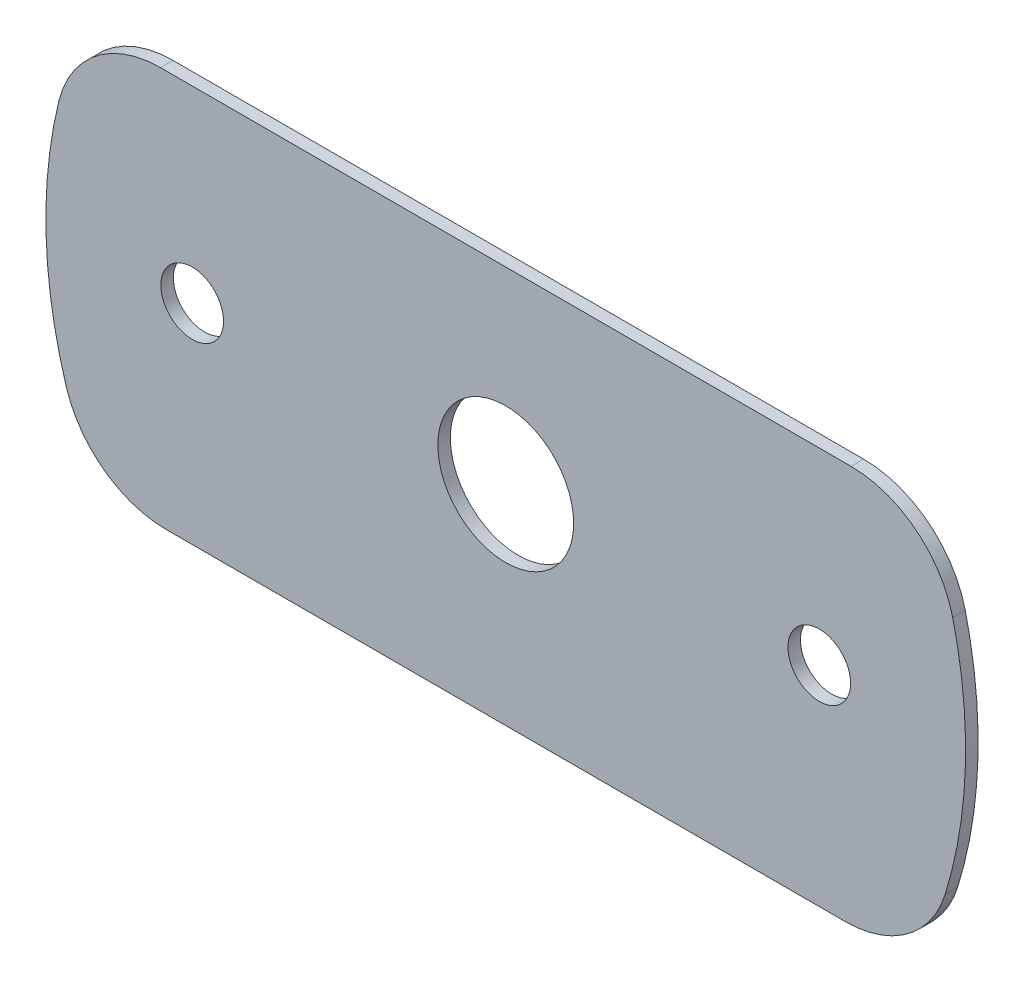
ISO-10303-21;
HEADER;
FILE_DESCRIPTION(('STEP AP214'),'2;1');
FILE_NAME('part.step','',(''),(''),'','','');
FILE_SCHEMA(('AUTOMOTIVE_DESIGN { 1 0 10303 214 1 1 1 1 }'));
ENDSEC;
DATA;
#1=APPLICATION_CONTEXT('core data for automotive mechanical design processes');
#2=APPLICATION_PROTOCOL_DEFINITION('international standard','automotive_design',2000,#1);
#3=PRODUCT_CONTEXT('',#1,'mechanical');
#4=PRODUCT('Part','Part','',(#3));
#5=PRODUCT_RELATED_PRODUCT_CATEGORY('part','',(#4));
#6=PRODUCT_DEFINITION_FORMATION('','',#4);
#7=PRODUCT_DEFINITION_CONTEXT('part definition',#1,'design');
#8=PRODUCT_DEFINITION('design','',#6,#7);
#9=PRODUCT_DEFINITION_SHAPE('','',#8);
#10=(LENGTH_UNIT() NAMED_UNIT(*) SI_UNIT(.MILLI.,.METRE.));
#11=(NAMED_UNIT(*) PLANE_ANGLE_UNIT() SI_UNIT($,.RADIAN.));
#12=(NAMED_UNIT(*) SI_UNIT($,.STERADIAN.) SOLID_ANGLE_UNIT());
#13=UNCERTAINTY_MEASURE_WITH_UNIT(LENGTH_MEASURE(1.E-05),#10,'distance_accuracy_value','');
#14=(GEOMETRIC_REPRESENTATION_CONTEXT(3) GLOBAL_UNCERTAINTY_ASSIGNED_CONTEXT((#13)) GLOBAL_UNIT_ASSIGNED_CONTEXT((#10,
#11,#12)) REPRESENTATION_CONTEXT('',''));
#15=CARTESIAN_POINT('',(0.,0.,0.));
#16=DIRECTION('',(0.,0.,1.));
#17=DIRECTION('',(1.,0.,0.));
#18=AXIS2_PLACEMENT_3D('',#15,#16,#17);
#19=CARTESIAN_POINT('',(0.,0.,0.6));
#20=DIRECTION('',(0.,0.,-1.));
#21=DIRECTION('',(-1.,0.,0.));
#22=AXIS2_PLACEMENT_3D('',#19,#20,#21);
#23=CYLINDRICAL_SURFACE('',#22,22.);
#24=CARTESIAN_POINT('',(0.,0.,0.));
#25=DIRECTION('',(0.,0.,1.));
#26=DIRECTION('',(1.,0.,0.));
#27=AXIS2_PLACEMENT_3D('',#24,#25,#26);
#28=CIRCLE('',#27,22.);
#29=CARTESIAN_POINT('',(-21.3823327129931,5.17647058823529,0.));
#30=VERTEX_POINT('',#29);
#31=CARTESIAN_POINT('',(-21.026922929646,-6.47058823529412,0.));
#32=VERTEX_POINT('',#31);
#33=EDGE_CURVE('E126',#30,#32,#28,.T.);
#34=ORIENTED_EDGE('',*,*,#33,.T.);
#35=DIRECTION('',(0.,0.,-1.));
#36=VECTOR('',#35,1.);
#37=CARTESIAN_POINT('',(-21.026922929646,-6.47058823529412,0.6));
#38=LINE('',#37,#36);
#39=CARTESIAN_POINT('',(-21.026922929646,-6.47058823529412,0.6));
#40=VERTEX_POINT('',#39);
#41=EDGE_CURVE('E11',#32,#40,#38,.F.);
#42=ORIENTED_EDGE('',*,*,#41,.T.);
#43=CARTESIAN_POINT('',(0.,0.,0.6));
#44=DIRECTION('',(0.,0.,1.));
#45=DIRECTION('',(1.,0.,0.));
#46=AXIS2_PLACEMENT_3D('',#43,#44,#45);
#47=CIRCLE('',#46,22.);
#48=CARTESIAN_POINT('',(-21.3823327129931,5.17647058823529,0.6));
#49=VERTEX_POINT('',#48);
#50=EDGE_CURVE('E135',#49,#40,#47,.T.);
#51=ORIENTED_EDGE('',*,*,#50,.F.);
#52=DIRECTION('',(0.,0.,-1.));
#53=VECTOR('',#52,1.);
#54=CARTESIAN_POINT('',(-21.3823327129931,5.17647058823529,0.6));
#55=LINE('',#54,#53);
#56=EDGE_CURVE('E45',#49,#30,#55,.T.);
#57=ORIENTED_EDGE('',*,*,#56,.T.);
#58=EDGE_LOOP('',(#34,#42,#51,#57));
#59=FACE_BOUND('',#58,.T.);
#60=ADVANCED_FACE('F37',(#59),#23,.T.);
#61=CARTESIAN_POINT('',(21.026922929646,-6.47058823529412,0.));
#62=VERTEX_POINT('',#61);
#63=CARTESIAN_POINT('',(21.3823327129931,5.17647058823529,0.));
#64=VERTEX_POINT('',#63);
#65=EDGE_CURVE('E116',#62,#64,#28,.T.);
#66=ORIENTED_EDGE('',*,*,#65,.T.);
#67=DIRECTION('',(0.,0.,-1.));
#68=VECTOR('',#67,1.);
#69=CARTESIAN_POINT('',(21.3823327129931,5.17647058823529,0.6));
#70=LINE('',#69,#68);
#71=CARTESIAN_POINT('',(21.3823327129931,5.17647058823529,0.6));
#72=VERTEX_POINT('',#71);
#73=EDGE_CURVE('E120',#64,#72,#70,.F.);
#74=ORIENTED_EDGE('',*,*,#73,.T.);
#75=CARTESIAN_POINT('',(21.026922929646,-6.47058823529412,0.6));
#76=VERTEX_POINT('',#75);
#77=EDGE_CURVE('E119',#76,#72,#47,.T.);
#78=ORIENTED_EDGE('',*,*,#77,.F.);
#79=DIRECTION('',(0.,0.,-1.));
#80=VECTOR('',#79,1.);
#81=CARTESIAN_POINT('',(21.026922929646,-6.47058823529412,0.6));
#82=LINE('',#81,#80);
#83=EDGE_CURVE('E106',#76,#62,#82,.T.);
#84=ORIENTED_EDGE('',*,*,#83,.T.);
#85=EDGE_LOOP('',(#66,#74,#78,#84));
#86=FACE_BOUND('',#85,.T.);
#87=ADVANCED_FACE('F114',(#86),#23,.T.);
#88=CARTESIAN_POINT('',(0.,0.,0.6));
#89=DIRECTION('',(0.,0.,1.));
#90=DIRECTION('',(1.,0.,0.));
#91=AXIS2_PLACEMENT_3D('',#88,#89,#90);
#92=PLANE('',#91);
#93=ORIENTED_EDGE('',*,*,#77,.T.);
#94=CARTESIAN_POINT('',(16.5227116418583,4.,0.6));
#95=DIRECTION('',(0.,0.,1.));
#96=DIRECTION('',(1.,0.,0.));
#97=AXIS2_PLACEMENT_3D('',#94,#95,#96);
#98=CIRCLE('',#97,5.);
#99=CARTESIAN_POINT('',(16.5227116418583,9.,0.6));
#100=VERTEX_POINT('',#99);
#101=EDGE_CURVE('E147',#72,#100,#98,.T.);
#102=ORIENTED_EDGE('',*,*,#101,.T.);
#103=DIRECTION('',(1.,0.,0.));
#104=VECTOR('',#103,1.);
#105=CARTESIAN_POINT('',(-27.9403656821378,9.,0.6));
#106=LINE('',#105,#104);
#107=CARTESIAN_POINT('',(-16.5227116418583,9.,0.6));
#108=VERTEX_POINT('',#107);
#109=EDGE_CURVE('E178',#108,#100,#106,.T.);
#110=ORIENTED_EDGE('',*,*,#109,.F.);
#111=CARTESIAN_POINT('',(-16.5227116418583,4.,0.6));
#112=DIRECTION('',(0.,0.,1.));
#113=DIRECTION('',(1.,0.,0.));
#114=AXIS2_PLACEMENT_3D('',#111,#112,#113);
#115=CIRCLE('',#114,5.);
#116=EDGE_CURVE('E141',#108,#49,#115,.T.);
#117=ORIENTED_EDGE('',*,*,#116,.T.);
#118=ORIENTED_EDGE('',*,*,#50,.T.);
#119=CARTESIAN_POINT('',(-16.2480768092719,-5.,0.6));
#120=DIRECTION('',(0.,0.,1.));
#121=DIRECTION('',(1.,0.,0.));
#122=AXIS2_PLACEMENT_3D('',#119,#120,#121);
#123=CIRCLE('',#122,5.);
#124=CARTESIAN_POINT('',(-16.2480768092719,-10.,0.6));
#125=VERTEX_POINT('',#124);
#126=EDGE_CURVE('E143',#40,#125,#123,.T.);
#127=ORIENTED_EDGE('',*,*,#126,.T.);
#128=DIRECTION('',(-1.,0.,0.));
#129=VECTOR('',#128,1.);
#130=CARTESIAN_POINT('',(-27.9403656821378,-10.,0.6));
#131=LINE('',#130,#129);
#132=CARTESIAN_POINT('',(16.2480768092719,-10.,0.6));
#133=VERTEX_POINT('',#132);
#134=EDGE_CURVE('E177',#133,#125,#131,.T.);
#135=ORIENTED_EDGE('',*,*,#134,.F.);
#136=CARTESIAN_POINT('',(16.2480768092719,-5.,0.6));
#137=DIRECTION('',(0.,0.,1.));
#138=DIRECTION('',(1.,0.,0.));
#139=AXIS2_PLACEMENT_3D('',#136,#137,#138);
#140=CIRCLE('',#139,5.);
#141=EDGE_CURVE('E145',#133,#76,#140,.T.);
#142=ORIENTED_EDGE('',*,*,#141,.T.);
#143=EDGE_LOOP('',(#93,#102,#110,#117,#118,#127,#135,#142));
#144=FACE_BOUND('',#143,.T.);
#145=CARTESIAN_POINT('',(-15.,0.,0.6));
#146=DIRECTION('',(0.,0.,1.));
#147=DIRECTION('',(1.,0.,0.));
#148=AXIS2_PLACEMENT_3D('',#145,#146,#147);
#149=CIRCLE('',#148,1.5);
#150=CARTESIAN_POINT('',(-13.5,0.,0.6));
#151=VERTEX_POINT('',#150);
#152=EDGE_CURVE('E186',#151,#151,#149,.T.);
#153=ORIENTED_EDGE('',*,*,#152,.F.);
#154=EDGE_LOOP('',(#153));
#155=FACE_BOUND('',#154,.T.);
#156=CARTESIAN_POINT('',(15.,0.,0.6));
#157=DIRECTION('',(0.,0.,1.));
#158=DIRECTION('',(1.,0.,0.));
#159=AXIS2_PLACEMENT_3D('',#156,#157,#158);
#160=CIRCLE('',#159,1.5);
#161=CARTESIAN_POINT('',(16.5,0.,0.6));
#162=VERTEX_POINT('',#161);
#163=EDGE_CURVE('E180',#162,#162,#160,.T.);
#164=ORIENTED_EDGE('',*,*,#163,.F.);
#165=EDGE_LOOP('',(#164));
#166=FACE_BOUND('',#165,.T.);
#167=CARTESIAN_POINT('',(0.,0.,0.6));
#168=DIRECTION('',(0.,0.,1.));
#169=DIRECTION('',(1.,0.,0.));
#170=AXIS2_PLACEMENT_3D('',#167,#168,#169);
#171=CIRCLE('',#170,3.25);
#172=CARTESIAN_POINT('',(3.25,0.,0.6));
#173=VERTEX_POINT('',#172);
#174=EDGE_CURVE('E131',#173,#173,#171,.T.);
#175=ORIENTED_EDGE('',*,*,#174,.F.);
#176=EDGE_LOOP('',(#175));
#177=FACE_BOUND('',#176,.T.);
#178=ADVANCED_FACE('F172',(#144,#155,#166,#177),#92,.T.);
#179=CARTESIAN_POINT('',(0.,0.,0.));
#180=DIRECTION('',(0.,0.,1.));
#181=DIRECTION('',(1.,0.,0.));
#182=AXIS2_PLACEMENT_3D('',#179,#180,#181);
#183=PLANE('',#182);
#184=CARTESIAN_POINT('',(-15.,0.,0.));
#185=DIRECTION('',(0.,0.,1.));
#186=DIRECTION('',(1.,0.,0.));
#187=AXIS2_PLACEMENT_3D('',#184,#185,#186);
#188=CIRCLE('',#187,1.5);
#189=CARTESIAN_POINT('',(-13.5,0.,0.));
#190=VERTEX_POINT('',#189);
#191=EDGE_CURVE('E183',#190,#190,#188,.T.);
#192=ORIENTED_EDGE('',*,*,#191,.T.);
#193=EDGE_LOOP('',(#192));
#194=FACE_BOUND('',#193,.T.);
#195=CARTESIAN_POINT('',(15.,0.,0.));
#196=DIRECTION('',(0.,0.,1.));
#197=DIRECTION('',(1.,0.,0.));
#198=AXIS2_PLACEMENT_3D('',#195,#196,#197);
#199=CIRCLE('',#198,1.5);
#200=CARTESIAN_POINT('',(16.5,0.,0.));
#201=VERTEX_POINT('',#200);
#202=EDGE_CURVE('E189',#201,#201,#199,.T.);
#203=ORIENTED_EDGE('',*,*,#202,.T.);
#204=EDGE_LOOP('',(#203));
#205=FACE_BOUND('',#204,.T.);
#206=CARTESIAN_POINT('',(0.,0.,0.));
#207=DIRECTION('',(0.,0.,1.));
#208=DIRECTION('',(1.,0.,0.));
#209=AXIS2_PLACEMENT_3D('',#206,#207,#208);
#210=CIRCLE('',#209,3.25);
#211=CARTESIAN_POINT('',(3.25,0.,0.));
#212=VERTEX_POINT('',#211);
#213=EDGE_CURVE('E127',#212,#212,#210,.T.);
#214=ORIENTED_EDGE('',*,*,#213,.T.);
#215=EDGE_LOOP('',(#214));
#216=FACE_BOUND('',#215,.T.);
#217=DIRECTION('',(1.,0.,0.));
#218=VECTOR('',#217,1.);
#219=CARTESIAN_POINT('',(0.,9.,0.));
#220=LINE('',#219,#218);
#221=CARTESIAN_POINT('',(-16.5227116418583,9.,0.));
#222=VERTEX_POINT('',#221);
#223=CARTESIAN_POINT('',(16.5227116418583,9.,0.));
#224=VERTEX_POINT('',#223);
#225=EDGE_CURVE('E121',#222,#224,#220,.T.);
#226=ORIENTED_EDGE('',*,*,#225,.T.);
#227=CARTESIAN_POINT('',(16.5227116418583,4.,0.));
#228=DIRECTION('',(0.,0.,1.));
#229=DIRECTION('',(1.,0.,0.));
#230=AXIS2_PLACEMENT_3D('',#227,#228,#229);
#231=CIRCLE('',#230,5.);
#232=EDGE_CURVE('E108',#224,#64,#231,.F.);
#233=ORIENTED_EDGE('',*,*,#232,.T.);
#234=ORIENTED_EDGE('',*,*,#65,.F.);
#235=CARTESIAN_POINT('',(16.2480768092719,-5.,0.));
#236=DIRECTION('',(0.,0.,1.));
#237=DIRECTION('',(1.,0.,0.));
#238=AXIS2_PLACEMENT_3D('',#235,#236,#237);
#239=CIRCLE('',#238,5.);
#240=CARTESIAN_POINT('',(16.2480768092719,-10.,0.));
#241=VERTEX_POINT('',#240);
#242=EDGE_CURVE('E59',#62,#241,#239,.F.);
#243=ORIENTED_EDGE('',*,*,#242,.T.);
#244=DIRECTION('',(-1.,0.,0.));
#245=VECTOR('',#244,1.);
#246=CARTESIAN_POINT('',(0.,-10.,0.));
#247=LINE('',#246,#245);
#248=CARTESIAN_POINT('',(-16.2480768092719,-10.,0.));
#249=VERTEX_POINT('',#248);
#250=EDGE_CURVE('E137',#241,#249,#247,.T.);
#251=ORIENTED_EDGE('',*,*,#250,.T.);
#252=CARTESIAN_POINT('',(-16.2480768092719,-5.,0.));
#253=DIRECTION('',(0.,0.,1.));
#254=DIRECTION('',(1.,0.,0.));
#255=AXIS2_PLACEMENT_3D('',#252,#253,#254);
#256=CIRCLE('',#255,5.);
#257=EDGE_CURVE('E109',#249,#32,#256,.F.);
#258=ORIENTED_EDGE('',*,*,#257,.T.);
#259=ORIENTED_EDGE('',*,*,#33,.F.);
#260=CARTESIAN_POINT('',(-16.5227116418583,4.,0.));
#261=DIRECTION('',(0.,0.,1.));
#262=DIRECTION('',(1.,0.,0.));
#263=AXIS2_PLACEMENT_3D('',#260,#261,#262);
#264=CIRCLE('',#263,5.);
#265=EDGE_CURVE('E153',#30,#222,#264,.F.);
#266=ORIENTED_EDGE('',*,*,#265,.T.);
#267=EDGE_LOOP('',(#226,#233,#234,#243,#251,#258,#259,#266));
#268=FACE_BOUND('',#267,.T.);
#269=ADVANCED_FACE('F124',(#194,#205,#216,#268),#183,.F.);
#270=CARTESIAN_POINT('',(0.,0.,0.));
#271=DIRECTION('',(0.,0.,1.));
#272=DIRECTION('',(1.,0.,0.));
#273=AXIS2_PLACEMENT_3D('',#270,#271,#272);
#274=CYLINDRICAL_SURFACE('',#273,3.25);
#275=ORIENTED_EDGE('',*,*,#213,.F.);
#276=EDGE_LOOP('',(#275));
#277=FACE_BOUND('',#276,.T.);
#278=ORIENTED_EDGE('',*,*,#174,.T.);
#279=EDGE_LOOP('',(#278));
#280=FACE_BOUND('',#279,.T.);
#281=ADVANCED_FACE('F196',(#277,#280),#274,.F.);
#282=CARTESIAN_POINT('',(15.,0.,0.));
#283=DIRECTION('',(0.,0.,1.));
#284=DIRECTION('',(1.,0.,0.));
#285=AXIS2_PLACEMENT_3D('',#282,#283,#284);
#286=CYLINDRICAL_SURFACE('',#285,1.5);
#287=ORIENTED_EDGE('',*,*,#202,.F.);
#288=EDGE_LOOP('',(#287));
#289=FACE_BOUND('',#288,.T.);
#290=ORIENTED_EDGE('',*,*,#163,.T.);
#291=EDGE_LOOP('',(#290));
#292=FACE_BOUND('',#291,.T.);
#293=ADVANCED_FACE('F238',(#289,#292),#286,.F.);
#294=CARTESIAN_POINT('',(-15.,0.,0.));
#295=DIRECTION('',(0.,0.,1.));
#296=DIRECTION('',(1.,0.,0.));
#297=AXIS2_PLACEMENT_3D('',#294,#295,#296);
#298=CYLINDRICAL_SURFACE('',#297,1.5);
#299=ORIENTED_EDGE('',*,*,#191,.F.);
#300=EDGE_LOOP('',(#299));
#301=FACE_BOUND('',#300,.T.);
#302=ORIENTED_EDGE('',*,*,#152,.T.);
#303=EDGE_LOOP('',(#302));
#304=FACE_BOUND('',#303,.T.);
#305=ADVANCED_FACE('F233',(#301,#304),#298,.F.);
#306=CARTESIAN_POINT('',(-27.9403656821378,-10.,0.));
#307=DIRECTION('',(0.,1.,0.));
#308=DIRECTION('',(0.,0.,1.));
#309=AXIS2_PLACEMENT_3D('',#306,#307,#308);
#310=PLANE('',#309);
#311=ORIENTED_EDGE('',*,*,#250,.F.);
#312=DIRECTION('',(0.,0.,-1.));
#313=VECTOR('',#312,1.);
#314=CARTESIAN_POINT('',(16.2480768092719,-10.,0.));
#315=LINE('',#314,#313);
#316=EDGE_CURVE('E107',#241,#133,#315,.F.);
#317=ORIENTED_EDGE('',*,*,#316,.T.);
#318=ORIENTED_EDGE('',*,*,#134,.T.);
#319=DIRECTION('',(0.,0.,-1.));
#320=VECTOR('',#319,1.);
#321=CARTESIAN_POINT('',(-16.2480768092719,-10.,0.));
#322=LINE('',#321,#320);
#323=EDGE_CURVE('E52',#125,#249,#322,.T.);
#324=ORIENTED_EDGE('',*,*,#323,.T.);
#325=EDGE_LOOP('',(#311,#317,#318,#324));
#326=FACE_BOUND('',#325,.T.);
#327=ADVANCED_FACE('F228',(#326),#310,.F.);
#328=CARTESIAN_POINT('',(-27.9403656821378,9.,0.));
#329=DIRECTION('',(0.,-1.,0.));
#330=DIRECTION('',(0.,0.,-1.));
#331=AXIS2_PLACEMENT_3D('',#328,#329,#330);
#332=PLANE('',#331);
#333=ORIENTED_EDGE('',*,*,#109,.T.);
#334=DIRECTION('',(0.,0.,-1.));
#335=VECTOR('',#334,1.);
#336=CARTESIAN_POINT('',(16.5227116418583,9.,0.));
#337=LINE('',#336,#335);
#338=EDGE_CURVE('E151',#100,#224,#337,.T.);
#339=ORIENTED_EDGE('',*,*,#338,.T.);
#340=ORIENTED_EDGE('',*,*,#225,.F.);
#341=DIRECTION('',(0.,0.,-1.));
#342=VECTOR('',#341,1.);
#343=CARTESIAN_POINT('',(-16.5227116418583,9.,0.));
#344=LINE('',#343,#342);
#345=EDGE_CURVE('E149',#222,#108,#344,.F.);
#346=ORIENTED_EDGE('',*,*,#345,.T.);
#347=EDGE_LOOP('',(#333,#339,#340,#346));
#348=FACE_BOUND('',#347,.T.);
#349=ADVANCED_FACE('F215',(#348),#332,.F.);
#350=CARTESIAN_POINT('',(16.5227116418583,4.,0.6));
#351=DIRECTION('',(0.,0.,-1.));
#352=DIRECTION('',(-1.,0.,0.));
#353=AXIS2_PLACEMENT_3D('',#350,#351,#352);
#354=CYLINDRICAL_SURFACE('',#353,5.);
#355=ORIENTED_EDGE('',*,*,#232,.F.);
#356=ORIENTED_EDGE('',*,*,#338,.F.);
#357=ORIENTED_EDGE('',*,*,#101,.F.);
#358=ORIENTED_EDGE('',*,*,#73,.F.);
#359=EDGE_LOOP('',(#355,#356,#357,#358));
#360=FACE_BOUND('',#359,.T.);
#361=ADVANCED_FACE('F212',(#360),#354,.T.);
#362=CARTESIAN_POINT('',(16.2480768092719,-5.,0.6));
#363=DIRECTION('',(0.,0.,-1.));
#364=DIRECTION('',(-1.,0.,0.));
#365=AXIS2_PLACEMENT_3D('',#362,#363,#364);
#366=CYLINDRICAL_SURFACE('',#365,5.);
#367=ORIENTED_EDGE('',*,*,#141,.F.);
#368=ORIENTED_EDGE('',*,*,#316,.F.);
#369=ORIENTED_EDGE('',*,*,#242,.F.);
#370=ORIENTED_EDGE('',*,*,#83,.F.);
#371=EDGE_LOOP('',(#367,#368,#369,#370));
#372=FACE_BOUND('',#371,.T.);
#373=ADVANCED_FACE('F105',(#372),#366,.T.);
#374=CARTESIAN_POINT('',(-16.2480768092719,-5.,0.6));
#375=DIRECTION('',(0.,0.,-1.));
#376=DIRECTION('',(-1.,0.,0.));
#377=AXIS2_PLACEMENT_3D('',#374,#375,#376);
#378=CYLINDRICAL_SURFACE('',#377,5.);
#379=ORIENTED_EDGE('',*,*,#257,.F.);
#380=ORIENTED_EDGE('',*,*,#323,.F.);
#381=ORIENTED_EDGE('',*,*,#126,.F.);
#382=ORIENTED_EDGE('',*,*,#41,.F.);
#383=EDGE_LOOP('',(#379,#380,#381,#382));
#384=FACE_BOUND('',#383,.T.);
#385=ADVANCED_FACE('F170',(#384),#378,.T.);
#386=CARTESIAN_POINT('',(-16.5227116418583,4.,0.6));
#387=DIRECTION('',(0.,0.,-1.));
#388=DIRECTION('',(-1.,0.,0.));
#389=AXIS2_PLACEMENT_3D('',#386,#387,#388);
#390=CYLINDRICAL_SURFACE('',#389,5.);
#391=ORIENTED_EDGE('',*,*,#116,.F.);
#392=ORIENTED_EDGE('',*,*,#345,.F.);
#393=ORIENTED_EDGE('',*,*,#265,.F.);
#394=ORIENTED_EDGE('',*,*,#56,.F.);
#395=EDGE_LOOP('',(#391,#392,#393,#394));
#396=FACE_BOUND('',#395,.T.);
#397=ADVANCED_FACE('F39',(#396),#390,.T.);
#398=CLOSED_SHELL('',(#60,#87,#178,#269,#281,#293,#305,#327,#349,#361,#373,#385,#397));
#399=MANIFOLD_SOLID_BREP('B2',#398);
#400=ADVANCED_BREP_SHAPE_REPRESENTATION('',(#18,#399),#14);
#401=SHAPE_DEFINITION_REPRESENTATION(#9,#400);
ENDSEC;
END-ISO-10303-21;
